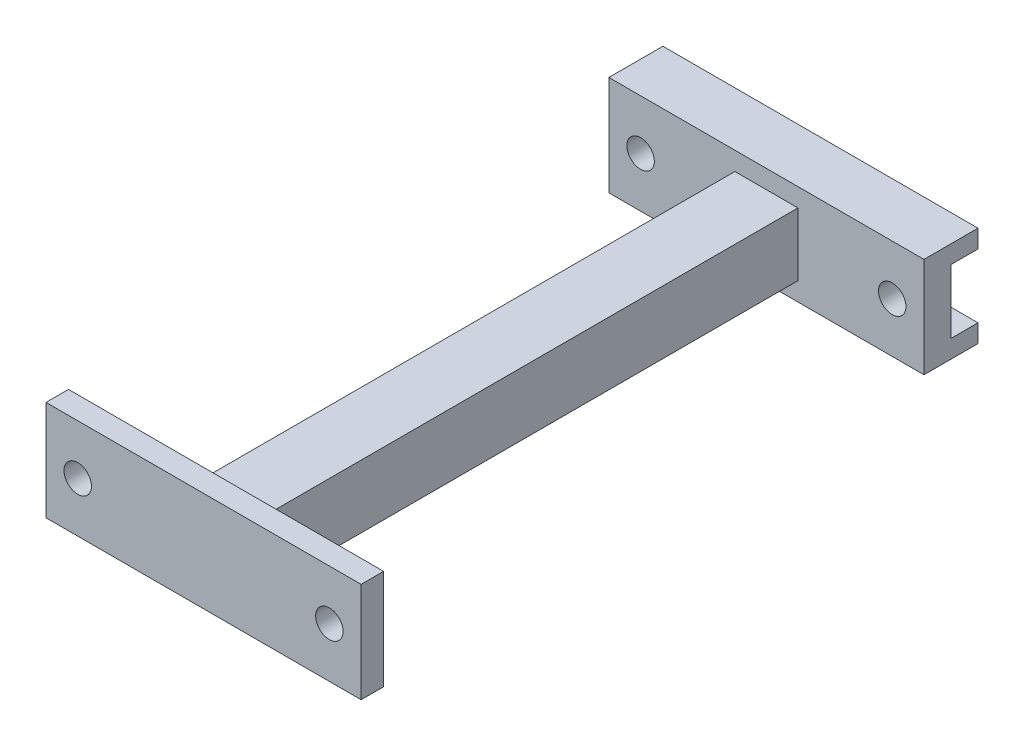
ISO-10303-21;
HEADER;
FILE_DESCRIPTION(('STEP AP214'),'2;1');
FILE_NAME('part.step','',(''),(''),'','','');
FILE_SCHEMA(('AUTOMOTIVE_DESIGN { 1 0 10303 214 1 1 1 1 }'));
ENDSEC;
DATA;
#1=APPLICATION_CONTEXT('core data for automotive mechanical design processes');
#2=APPLICATION_PROTOCOL_DEFINITION('international standard','automotive_design',2000,#1);
#3=PRODUCT_CONTEXT('',#1,'mechanical');
#4=PRODUCT('Part','Part','',(#3));
#5=PRODUCT_RELATED_PRODUCT_CATEGORY('part','',(#4));
#6=PRODUCT_DEFINITION_FORMATION('','',#4);
#7=PRODUCT_DEFINITION_CONTEXT('part definition',#1,'design');
#8=PRODUCT_DEFINITION('design','',#6,#7);
#9=PRODUCT_DEFINITION_SHAPE('','',#8);
#10=(LENGTH_UNIT() NAMED_UNIT(*) SI_UNIT(.MILLI.,.METRE.));
#11=(NAMED_UNIT(*) PLANE_ANGLE_UNIT() SI_UNIT($,.RADIAN.));
#12=(NAMED_UNIT(*) SI_UNIT($,.STERADIAN.) SOLID_ANGLE_UNIT());
#13=UNCERTAINTY_MEASURE_WITH_UNIT(LENGTH_MEASURE(1.E-05),#10,'distance_accuracy_value','');
#14=(GEOMETRIC_REPRESENTATION_CONTEXT(3) GLOBAL_UNCERTAINTY_ASSIGNED_CONTEXT((#13)) GLOBAL_UNIT_ASSIGNED_CONTEXT((#10,
#11,#12)) REPRESENTATION_CONTEXT('',''));
#15=CARTESIAN_POINT('',(0.,0.,0.));
#16=DIRECTION('',(0.,0.,1.));
#17=DIRECTION('',(1.,0.,0.));
#18=AXIS2_PLACEMENT_3D('',#15,#16,#17);
#19=CARTESIAN_POINT('',(0.,0.,3.));
#20=DIRECTION('',(0.,0.,1.));
#21=DIRECTION('',(1.,0.,0.));
#22=AXIS2_PLACEMENT_3D('',#19,#20,#21);
#23=PLANE('',#22);
#24=CARTESIAN_POINT('',(27.94,0.,3.));
#25=DIRECTION('',(0.,0.,1.));
#26=DIRECTION('',(1.,0.,0.));
#27=AXIS2_PLACEMENT_3D('',#24,#25,#26);
#28=CIRCLE('',#27,1.525);
#29=CARTESIAN_POINT('',(29.465,0.,3.));
#30=VERTEX_POINT('',#29);
#31=EDGE_CURVE('E269',#30,#30,#28,.T.);
#32=ORIENTED_EDGE('',*,*,#31,.F.);
#33=EDGE_LOOP('',(#32));
#34=FACE_BOUND('',#33,.T.);
#35=DIRECTION('',(0.,-1.,0.));
#36=VECTOR('',#35,1.);
#37=CARTESIAN_POINT('',(-3.525,3.55,3.));
#38=LINE('',#37,#36);
#39=CARTESIAN_POINT('',(-3.525,5.55,3.));
#40=VERTEX_POINT('',#39);
#41=CARTESIAN_POINT('',(-3.525,-5.55,3.));
#42=VERTEX_POINT('',#41);
#43=EDGE_CURVE('E43',#40,#42,#38,.T.);
#44=ORIENTED_EDGE('',*,*,#43,.T.);
#45=DIRECTION('',(1.,0.,0.));
#46=VECTOR('',#45,1.);
#47=CARTESIAN_POINT('',(31.465,-5.55,3.));
#48=LINE('',#47,#46);
#49=CARTESIAN_POINT('',(31.465,-5.55,3.));
#50=VERTEX_POINT('',#49);
#51=EDGE_CURVE('E234',#42,#50,#48,.T.);
#52=ORIENTED_EDGE('',*,*,#51,.T.);
#53=DIRECTION('',(0.,1.,0.));
#54=VECTOR('',#53,1.);
#55=CARTESIAN_POINT('',(31.465,3.55,3.));
#56=LINE('',#55,#54);
#57=CARTESIAN_POINT('',(31.465,5.55,3.));
#58=VERTEX_POINT('',#57);
#59=EDGE_CURVE('E11',#50,#58,#56,.T.);
#60=ORIENTED_EDGE('',*,*,#59,.T.);
#61=DIRECTION('',(-1.,0.,0.));
#62=VECTOR('',#61,1.);
#63=CARTESIAN_POINT('',(31.465,5.55,3.));
#64=LINE('',#63,#62);
#65=EDGE_CURVE('E209',#58,#40,#64,.T.);
#66=ORIENTED_EDGE('',*,*,#65,.T.);
#67=EDGE_LOOP('',(#44,#52,#60,#66));
#68=FACE_BOUND('',#67,.T.);
#69=CARTESIAN_POINT('',(0.,0.,3.));
#70=DIRECTION('',(0.,0.,1.));
#71=DIRECTION('',(1.,0.,0.));
#72=AXIS2_PLACEMENT_3D('',#69,#70,#71);
#73=CIRCLE('',#72,1.525);
#74=CARTESIAN_POINT('',(1.525,0.,3.));
#75=VERTEX_POINT('',#74);
#76=EDGE_CURVE('E275',#75,#75,#73,.T.);
#77=ORIENTED_EDGE('',*,*,#76,.F.);
#78=EDGE_LOOP('',(#77));
#79=FACE_BOUND('',#78,.T.);
#80=DIRECTION('',(1.,0.,0.));
#81=VECTOR('',#80,1.);
#82=CARTESIAN_POINT('',(10.47,-3.5,3.));
#83=LINE('',#82,#81);
#84=CARTESIAN_POINT('',(10.47,-3.5,3.));
#85=VERTEX_POINT('',#84);
#86=CARTESIAN_POINT('',(17.47,-3.5,3.));
#87=VERTEX_POINT('',#86);
#88=EDGE_CURVE('E177',#85,#87,#83,.T.);
#89=ORIENTED_EDGE('',*,*,#88,.F.);
#90=DIRECTION('',(0.,-1.,0.));
#91=VECTOR('',#90,1.);
#92=CARTESIAN_POINT('',(10.47,3.5,3.));
#93=LINE('',#92,#91);
#94=CARTESIAN_POINT('',(10.47,3.5,3.));
#95=VERTEX_POINT('',#94);
#96=EDGE_CURVE('E174',#95,#85,#93,.T.);
#97=ORIENTED_EDGE('',*,*,#96,.F.);
#98=DIRECTION('',(-1.,0.,0.));
#99=VECTOR('',#98,1.);
#100=CARTESIAN_POINT('',(10.47,3.5,3.));
#101=LINE('',#100,#99);
#102=CARTESIAN_POINT('',(17.47,3.5,3.));
#103=VERTEX_POINT('',#102);
#104=EDGE_CURVE('E187',#103,#95,#101,.T.);
#105=ORIENTED_EDGE('',*,*,#104,.F.);
#106=DIRECTION('',(0.,1.,0.));
#107=VECTOR('',#106,1.);
#108=CARTESIAN_POINT('',(17.47,3.5,3.));
#109=LINE('',#108,#107);
#110=EDGE_CURVE('E198',#87,#103,#109,.T.);
#111=ORIENTED_EDGE('',*,*,#110,.F.);
#112=EDGE_LOOP('',(#89,#97,#105,#111));
#113=FACE_BOUND('',#112,.T.);
#114=ADVANCED_FACE('F33',(#34,#68,#79,#113),#23,.T.);
#115=CARTESIAN_POINT('',(0.,0.,0.));
#116=DIRECTION('',(0.,0.,1.));
#117=DIRECTION('',(1.,0.,0.));
#118=AXIS2_PLACEMENT_3D('',#115,#116,#117);
#119=PLANE('',#118);
#120=CARTESIAN_POINT('',(0.,0.,0.));
#121=DIRECTION('',(0.,0.,1.));
#122=DIRECTION('',(1.,0.,0.));
#123=AXIS2_PLACEMENT_3D('',#120,#121,#122);
#124=CIRCLE('',#123,1.525);
#125=CARTESIAN_POINT('',(1.525,0.,0.));
#126=VERTEX_POINT('',#125);
#127=EDGE_CURVE('E272',#126,#126,#124,.T.);
#128=ORIENTED_EDGE('',*,*,#127,.T.);
#129=EDGE_LOOP('',(#128));
#130=FACE_BOUND('',#129,.T.);
#131=DIRECTION('',(0.,-1.,0.));
#132=VECTOR('',#131,1.);
#133=CARTESIAN_POINT('',(-3.525,3.55,0.));
#134=LINE('',#133,#132);
#135=CARTESIAN_POINT('',(-3.525,3.55,0.));
#136=VERTEX_POINT('',#135);
#137=CARTESIAN_POINT('',(-3.525,-3.55,0.));
#138=VERTEX_POINT('',#137);
#139=EDGE_CURVE('E278',#136,#138,#134,.T.);
#140=ORIENTED_EDGE('',*,*,#139,.F.);
#141=DIRECTION('',(-1.,0.,0.));
#142=VECTOR('',#141,1.);
#143=CARTESIAN_POINT('',(-3.525,3.55,0.));
#144=LINE('',#143,#142);
#145=CARTESIAN_POINT('',(31.465,3.55,0.));
#146=VERTEX_POINT('',#145);
#147=EDGE_CURVE('E37',#146,#136,#144,.T.);
#148=ORIENTED_EDGE('',*,*,#147,.F.);
#149=DIRECTION('',(0.,1.,0.));
#150=VECTOR('',#149,1.);
#151=CARTESIAN_POINT('',(31.465,3.55,0.));
#152=LINE('',#151,#150);
#153=CARTESIAN_POINT('',(31.465,-3.55,0.));
#154=VERTEX_POINT('',#153);
#155=EDGE_CURVE('E59',#154,#146,#152,.T.);
#156=ORIENTED_EDGE('',*,*,#155,.F.);
#157=DIRECTION('',(1.,0.,0.));
#158=VECTOR('',#157,1.);
#159=CARTESIAN_POINT('',(-3.525,-3.55,0.));
#160=LINE('',#159,#158);
#161=EDGE_CURVE('E286',#138,#154,#160,.T.);
#162=ORIENTED_EDGE('',*,*,#161,.F.);
#163=EDGE_LOOP('',(#140,#148,#156,#162));
#164=FACE_BOUND('',#163,.T.);
#165=CARTESIAN_POINT('',(27.94,0.,0.));
#166=DIRECTION('',(0.,0.,1.));
#167=DIRECTION('',(1.,0.,0.));
#168=AXIS2_PLACEMENT_3D('',#165,#166,#167);
#169=CIRCLE('',#168,1.525);
#170=CARTESIAN_POINT('',(29.465,0.,0.));
#171=VERTEX_POINT('',#170);
#172=EDGE_CURVE('E257',#171,#171,#169,.T.);
#173=ORIENTED_EDGE('',*,*,#172,.T.);
#174=EDGE_LOOP('',(#173));
#175=FACE_BOUND('',#174,.T.);
#176=ADVANCED_FACE('F323',(#130,#164,#175),#119,.F.);
#177=CARTESIAN_POINT('',(-3.525,3.55,3.));
#178=DIRECTION('',(1.,0.,0.));
#179=DIRECTION('',(0.,0.,-1.));
#180=AXIS2_PLACEMENT_3D('',#177,#178,#179);
#181=PLANE('',#180);
#182=ORIENTED_EDGE('',*,*,#139,.T.);
#183=DIRECTION('',(0.,0.,1.));
#184=VECTOR('',#183,1.);
#185=CARTESIAN_POINT('',(-3.525,-3.55,-3.));
#186=LINE('',#185,#184);
#187=CARTESIAN_POINT('',(-3.525,-3.55,-3.));
#188=VERTEX_POINT('',#187);
#189=EDGE_CURVE('E261',#188,#138,#186,.T.);
#190=ORIENTED_EDGE('',*,*,#189,.F.);
#191=DIRECTION('',(0.,-1.,0.));
#192=VECTOR('',#191,1.);
#193=CARTESIAN_POINT('',(-3.525,-3.55,-3.));
#194=LINE('',#193,#192);
#195=CARTESIAN_POINT('',(-3.525,-5.55,-3.));
#196=VERTEX_POINT('',#195);
#197=EDGE_CURVE('E245',#188,#196,#194,.T.);
#198=ORIENTED_EDGE('',*,*,#197,.T.);
#199=DIRECTION('',(0.,0.,1.));
#200=VECTOR('',#199,1.);
#201=CARTESIAN_POINT('',(-3.525,-5.55,-3.));
#202=LINE('',#201,#200);
#203=EDGE_CURVE('E258',#196,#42,#202,.T.);
#204=ORIENTED_EDGE('',*,*,#203,.T.);
#205=ORIENTED_EDGE('',*,*,#43,.F.);
#206=DIRECTION('',(0.,0.,1.));
#207=VECTOR('',#206,1.);
#208=CARTESIAN_POINT('',(-3.525,5.55,-3.));
#209=LINE('',#208,#207);
#210=CARTESIAN_POINT('',(-3.525,5.55,-3.));
#211=VERTEX_POINT('',#210);
#212=EDGE_CURVE('E227',#211,#40,#209,.T.);
#213=ORIENTED_EDGE('',*,*,#212,.F.);
#214=DIRECTION('',(0.,-1.,0.));
#215=VECTOR('',#214,1.);
#216=CARTESIAN_POINT('',(-3.525,3.55,-3.));
#217=LINE('',#216,#215);
#218=CARTESIAN_POINT('',(-3.525,3.55,-3.));
#219=VERTEX_POINT('',#218);
#220=EDGE_CURVE('E219',#211,#219,#217,.T.);
#221=ORIENTED_EDGE('',*,*,#220,.T.);
#222=DIRECTION('',(0.,0.,1.));
#223=VECTOR('',#222,1.);
#224=CARTESIAN_POINT('',(-3.525,3.55,-3.));
#225=LINE('',#224,#223);
#226=EDGE_CURVE('E230',#219,#136,#225,.T.);
#227=ORIENTED_EDGE('',*,*,#226,.T.);
#228=EDGE_LOOP('',(#182,#190,#198,#204,#205,#213,#221,#227));
#229=FACE_BOUND('',#228,.T.);
#230=ADVANCED_FACE('F35',(#229),#181,.F.);
#231=CARTESIAN_POINT('',(31.465,3.55,3.));
#232=DIRECTION('',(-1.,0.,0.));
#233=DIRECTION('',(0.,0.,1.));
#234=AXIS2_PLACEMENT_3D('',#231,#232,#233);
#235=PLANE('',#234);
#236=ORIENTED_EDGE('',*,*,#155,.T.);
#237=DIRECTION('',(0.,0.,1.));
#238=VECTOR('',#237,1.);
#239=CARTESIAN_POINT('',(31.465,3.55,-3.));
#240=LINE('',#239,#238);
#241=CARTESIAN_POINT('',(31.465,3.55,-3.));
#242=VERTEX_POINT('',#241);
#243=EDGE_CURVE('E222',#242,#146,#240,.T.);
#244=ORIENTED_EDGE('',*,*,#243,.F.);
#245=DIRECTION('',(0.,1.,0.));
#246=VECTOR('',#245,1.);
#247=CARTESIAN_POINT('',(31.465,3.55,-3.));
#248=LINE('',#247,#246);
#249=CARTESIAN_POINT('',(31.465,5.55,-3.));
#250=VERTEX_POINT('',#249);
#251=EDGE_CURVE('E213',#242,#250,#248,.T.);
#252=ORIENTED_EDGE('',*,*,#251,.T.);
#253=DIRECTION('',(0.,0.,1.));
#254=VECTOR('',#253,1.);
#255=CARTESIAN_POINT('',(31.465,5.55,-3.));
#256=LINE('',#255,#254);
#257=EDGE_CURVE('E238',#250,#58,#256,.T.);
#258=ORIENTED_EDGE('',*,*,#257,.T.);
#259=ORIENTED_EDGE('',*,*,#59,.F.);
#260=DIRECTION('',(0.,0.,1.));
#261=VECTOR('',#260,1.);
#262=CARTESIAN_POINT('',(31.465,-5.55,-3.));
#263=LINE('',#262,#261);
#264=CARTESIAN_POINT('',(31.465,-5.55,-3.));
#265=VERTEX_POINT('',#264);
#266=EDGE_CURVE('E254',#265,#50,#263,.T.);
#267=ORIENTED_EDGE('',*,*,#266,.F.);
#268=DIRECTION('',(0.,1.,0.));
#269=VECTOR('',#268,1.);
#270=CARTESIAN_POINT('',(31.465,-3.55,-3.));
#271=LINE('',#270,#269);
#272=CARTESIAN_POINT('',(31.465,-3.55,-3.));
#273=VERTEX_POINT('',#272);
#274=EDGE_CURVE('E239',#265,#273,#271,.T.);
#275=ORIENTED_EDGE('',*,*,#274,.T.);
#276=DIRECTION('',(0.,0.,1.));
#277=VECTOR('',#276,1.);
#278=CARTESIAN_POINT('',(31.465,-3.55,-3.));
#279=LINE('',#278,#277);
#280=EDGE_CURVE('E251',#273,#154,#279,.T.);
#281=ORIENTED_EDGE('',*,*,#280,.T.);
#282=EDGE_LOOP('',(#236,#244,#252,#258,#259,#267,#275,#281));
#283=FACE_BOUND('',#282,.T.);
#284=ADVANCED_FACE('F304',(#283),#235,.F.);
#285=CARTESIAN_POINT('',(0.,0.,3.));
#286=DIRECTION('',(0.,0.,-1.));
#287=DIRECTION('',(-1.,0.,0.));
#288=AXIS2_PLACEMENT_3D('',#285,#286,#287);
#289=CYLINDRICAL_SURFACE('',#288,1.525);
#290=ORIENTED_EDGE('',*,*,#76,.T.);
#291=EDGE_LOOP('',(#290));
#292=FACE_BOUND('',#291,.T.);
#293=ORIENTED_EDGE('',*,*,#127,.F.);
#294=EDGE_LOOP('',(#293));
#295=FACE_BOUND('',#294,.T.);
#296=ADVANCED_FACE('F332',(#292,#295),#289,.F.);
#297=CARTESIAN_POINT('',(27.94,0.,3.));
#298=DIRECTION('',(0.,0.,-1.));
#299=DIRECTION('',(-1.,0.,0.));
#300=AXIS2_PLACEMENT_3D('',#297,#298,#299);
#301=CYLINDRICAL_SURFACE('',#300,1.525);
#302=ORIENTED_EDGE('',*,*,#31,.T.);
#303=EDGE_LOOP('',(#302));
#304=FACE_BOUND('',#303,.T.);
#305=ORIENTED_EDGE('',*,*,#172,.F.);
#306=EDGE_LOOP('',(#305));
#307=FACE_BOUND('',#306,.T.);
#308=ADVANCED_FACE('F330',(#304,#307),#301,.F.);
#309=CARTESIAN_POINT('',(31.465,-5.55,-3.));
#310=DIRECTION('',(0.,-1.,0.));
#311=DIRECTION('',(1.,0.,0.));
#312=AXIS2_PLACEMENT_3D('',#309,#310,#311);
#313=PLANE('',#312);
#314=ORIENTED_EDGE('',*,*,#51,.F.);
#315=ORIENTED_EDGE('',*,*,#203,.F.);
#316=DIRECTION('',(1.,0.,0.));
#317=VECTOR('',#316,1.);
#318=CARTESIAN_POINT('',(31.465,-5.55,-3.));
#319=LINE('',#318,#317);
#320=EDGE_CURVE('E248',#196,#265,#319,.T.);
#321=ORIENTED_EDGE('',*,*,#320,.T.);
#322=ORIENTED_EDGE('',*,*,#266,.T.);
#323=EDGE_LOOP('',(#314,#315,#321,#322));
#324=FACE_BOUND('',#323,.T.);
#325=ADVANCED_FACE('F308',(#324),#313,.T.);
#326=CARTESIAN_POINT('',(31.465,-3.55,-3.));
#327=DIRECTION('',(0.,1.,0.));
#328=DIRECTION('',(-1.,0.,0.));
#329=AXIS2_PLACEMENT_3D('',#326,#327,#328);
#330=PLANE('',#329);
#331=ORIENTED_EDGE('',*,*,#189,.T.);
#332=ORIENTED_EDGE('',*,*,#161,.T.);
#333=ORIENTED_EDGE('',*,*,#280,.F.);
#334=DIRECTION('',(-1.,0.,0.));
#335=VECTOR('',#334,1.);
#336=CARTESIAN_POINT('',(31.465,-3.55,-3.));
#337=LINE('',#336,#335);
#338=EDGE_CURVE('E242',#273,#188,#337,.T.);
#339=ORIENTED_EDGE('',*,*,#338,.T.);
#340=EDGE_LOOP('',(#331,#332,#333,#339));
#341=FACE_BOUND('',#340,.T.);
#342=ADVANCED_FACE('F298',(#341),#330,.T.);
#343=CARTESIAN_POINT('',(0.,0.,-3.));
#344=DIRECTION('',(0.,0.,-1.));
#345=DIRECTION('',(-1.,0.,0.));
#346=AXIS2_PLACEMENT_3D('',#343,#344,#345);
#347=PLANE('',#346);
#348=ORIENTED_EDGE('',*,*,#274,.F.);
#349=ORIENTED_EDGE('',*,*,#320,.F.);
#350=ORIENTED_EDGE('',*,*,#197,.F.);
#351=ORIENTED_EDGE('',*,*,#338,.F.);
#352=EDGE_LOOP('',(#348,#349,#350,#351));
#353=FACE_BOUND('',#352,.T.);
#354=ADVANCED_FACE('F302',(#353),#347,.T.);
#355=CARTESIAN_POINT('',(31.465,3.55,-3.));
#356=DIRECTION('',(0.,-1.,0.));
#357=DIRECTION('',(1.,0.,0.));
#358=AXIS2_PLACEMENT_3D('',#355,#356,#357);
#359=PLANE('',#358);
#360=ORIENTED_EDGE('',*,*,#243,.T.);
#361=ORIENTED_EDGE('',*,*,#147,.T.);
#362=ORIENTED_EDGE('',*,*,#226,.F.);
#363=DIRECTION('',(1.,0.,0.));
#364=VECTOR('',#363,1.);
#365=CARTESIAN_POINT('',(31.465,3.55,-3.));
#366=LINE('',#365,#364);
#367=EDGE_CURVE('E210',#219,#242,#366,.T.);
#368=ORIENTED_EDGE('',*,*,#367,.T.);
#369=EDGE_LOOP('',(#360,#361,#362,#368));
#370=FACE_BOUND('',#369,.T.);
#371=ADVANCED_FACE('F322',(#370),#359,.T.);
#372=CARTESIAN_POINT('',(31.465,5.55,-3.));
#373=DIRECTION('',(0.,1.,0.));
#374=DIRECTION('',(-1.,0.,0.));
#375=AXIS2_PLACEMENT_3D('',#372,#373,#374);
#376=PLANE('',#375);
#377=ORIENTED_EDGE('',*,*,#65,.F.);
#378=ORIENTED_EDGE('',*,*,#257,.F.);
#379=DIRECTION('',(-1.,0.,0.));
#380=VECTOR('',#379,1.);
#381=CARTESIAN_POINT('',(31.465,5.55,-3.));
#382=LINE('',#381,#380);
#383=EDGE_CURVE('E216',#250,#211,#382,.T.);
#384=ORIENTED_EDGE('',*,*,#383,.T.);
#385=ORIENTED_EDGE('',*,*,#212,.T.);
#386=EDGE_LOOP('',(#377,#378,#384,#385));
#387=FACE_BOUND('',#386,.T.);
#388=ADVANCED_FACE('F314',(#387),#376,.T.);
#389=CARTESIAN_POINT('',(0.,0.,-3.));
#390=DIRECTION('',(0.,0.,-1.));
#391=DIRECTION('',(-1.,0.,0.));
#392=AXIS2_PLACEMENT_3D('',#389,#390,#391);
#393=PLANE('',#392);
#394=ORIENTED_EDGE('',*,*,#367,.F.);
#395=ORIENTED_EDGE('',*,*,#220,.F.);
#396=ORIENTED_EDGE('',*,*,#383,.F.);
#397=ORIENTED_EDGE('',*,*,#251,.F.);
#398=EDGE_LOOP('',(#394,#395,#396,#397));
#399=FACE_BOUND('',#398,.T.);
#400=ADVANCED_FACE('F320',(#399),#393,.T.);
#401=CARTESIAN_POINT('',(10.47,3.5,63.));
#402=DIRECTION('',(1.,0.,0.));
#403=DIRECTION('',(0.,1.,0.));
#404=AXIS2_PLACEMENT_3D('',#401,#402,#403);
#405=PLANE('',#404);
#406=ORIENTED_EDGE('',*,*,#96,.T.);
#407=DIRECTION('',(0.,0.,-1.));
#408=VECTOR('',#407,1.);
#409=CARTESIAN_POINT('',(10.47,-3.5,63.));
#410=LINE('',#409,#408);
#411=CARTESIAN_POINT('',(10.47,-3.5,63.));
#412=VERTEX_POINT('',#411);
#413=EDGE_CURVE('E207',#412,#85,#410,.T.);
#414=ORIENTED_EDGE('',*,*,#413,.F.);
#415=DIRECTION('',(0.,-1.,0.));
#416=VECTOR('',#415,1.);
#417=CARTESIAN_POINT('',(10.47,3.5,63.));
#418=LINE('',#417,#416);
#419=CARTESIAN_POINT('',(10.47,3.5,63.));
#420=VERTEX_POINT('',#419);
#421=EDGE_CURVE('E183',#420,#412,#418,.T.);
#422=ORIENTED_EDGE('',*,*,#421,.F.);
#423=DIRECTION('',(0.,0.,-1.));
#424=VECTOR('',#423,1.);
#425=CARTESIAN_POINT('',(10.47,3.5,63.));
#426=LINE('',#425,#424);
#427=EDGE_CURVE('E195',#420,#95,#426,.T.);
#428=ORIENTED_EDGE('',*,*,#427,.T.);
#429=EDGE_LOOP('',(#406,#414,#422,#428));
#430=FACE_BOUND('',#429,.T.);
#431=ADVANCED_FACE('F429',(#430),#405,.F.);
#432=CARTESIAN_POINT('',(10.47,-3.5,63.));
#433=DIRECTION('',(0.,1.,0.));
#434=DIRECTION('',(0.,0.,1.));
#435=AXIS2_PLACEMENT_3D('',#432,#433,#434);
#436=PLANE('',#435);
#437=ORIENTED_EDGE('',*,*,#88,.T.);
#438=DIRECTION('',(0.,0.,-1.));
#439=VECTOR('',#438,1.);
#440=CARTESIAN_POINT('',(17.47,-3.5,63.));
#441=LINE('',#440,#439);
#442=CARTESIAN_POINT('',(17.47,-3.5,63.));
#443=VERTEX_POINT('',#442);
#444=EDGE_CURVE('E204',#443,#87,#441,.T.);
#445=ORIENTED_EDGE('',*,*,#444,.F.);
#446=DIRECTION('',(1.,0.,0.));
#447=VECTOR('',#446,1.);
#448=CARTESIAN_POINT('',(10.47,-3.5,63.));
#449=LINE('',#448,#447);
#450=EDGE_CURVE('E186',#412,#443,#449,.T.);
#451=ORIENTED_EDGE('',*,*,#450,.F.);
#452=ORIENTED_EDGE('',*,*,#413,.T.);
#453=EDGE_LOOP('',(#437,#445,#451,#452));
#454=FACE_BOUND('',#453,.T.);
#455=ADVANCED_FACE('F447',(#454),#436,.F.);
#456=CARTESIAN_POINT('',(17.47,3.5,63.));
#457=DIRECTION('',(-1.,0.,0.));
#458=DIRECTION('',(0.,0.,1.));
#459=AXIS2_PLACEMENT_3D('',#456,#457,#458);
#460=PLANE('',#459);
#461=ORIENTED_EDGE('',*,*,#110,.T.);
#462=DIRECTION('',(0.,0.,-1.));
#463=VECTOR('',#462,1.);
#464=CARTESIAN_POINT('',(17.47,3.5,63.));
#465=LINE('',#464,#463);
#466=CARTESIAN_POINT('',(17.47,3.5,63.));
#467=VERTEX_POINT('',#466);
#468=EDGE_CURVE('E51',#467,#103,#465,.T.);
#469=ORIENTED_EDGE('',*,*,#468,.F.);
#470=DIRECTION('',(0.,1.,0.));
#471=VECTOR('',#470,1.);
#472=CARTESIAN_POINT('',(17.47,3.5,63.));
#473=LINE('',#472,#471);
#474=EDGE_CURVE('E190',#443,#467,#473,.T.);
#475=ORIENTED_EDGE('',*,*,#474,.F.);
#476=ORIENTED_EDGE('',*,*,#444,.T.);
#477=EDGE_LOOP('',(#461,#469,#475,#476));
#478=FACE_BOUND('',#477,.T.);
#479=ADVANCED_FACE('F456',(#478),#460,.F.);
#480=CARTESIAN_POINT('',(10.47,3.5,63.));
#481=DIRECTION('',(0.,-1.,0.));
#482=DIRECTION('',(0.,0.,-1.));
#483=AXIS2_PLACEMENT_3D('',#480,#481,#482);
#484=PLANE('',#483);
#485=ORIENTED_EDGE('',*,*,#104,.T.);
#486=ORIENTED_EDGE('',*,*,#427,.F.);
#487=DIRECTION('',(-1.,0.,0.));
#488=VECTOR('',#487,1.);
#489=CARTESIAN_POINT('',(10.47,3.5,63.));
#490=LINE('',#489,#488);
#491=EDGE_CURVE('E193',#467,#420,#490,.T.);
#492=ORIENTED_EDGE('',*,*,#491,.F.);
#493=ORIENTED_EDGE('',*,*,#468,.T.);
#494=EDGE_LOOP('',(#485,#486,#492,#493));
#495=FACE_BOUND('',#494,.T.);
#496=ADVANCED_FACE('F465',(#495),#484,.F.);
#497=CARTESIAN_POINT('',(0.,0.,63.));
#498=DIRECTION('',(0.,0.,1.));
#499=DIRECTION('',(1.,0.,0.));
#500=AXIS2_PLACEMENT_3D('',#497,#498,#499);
#501=PLANE('',#500);
#502=CARTESIAN_POINT('',(27.94,0.,63.));
#503=DIRECTION('',(0.,0.,1.));
#504=DIRECTION('',(1.,0.,0.));
#505=AXIS2_PLACEMENT_3D('',#502,#503,#504);
#506=CIRCLE('',#505,1.525);
#507=CARTESIAN_POINT('',(29.465,0.,63.));
#508=VERTEX_POINT('',#507);
#509=EDGE_CURVE('E566',#508,#508,#506,.T.);
#510=ORIENTED_EDGE('',*,*,#509,.T.);
#511=EDGE_LOOP('',(#510));
#512=FACE_BOUND('',#511,.T.);
#513=DIRECTION('',(-1.,0.,0.));
#514=VECTOR('',#513,1.);
#515=CARTESIAN_POINT('',(31.465,5.55,63.));
#516=LINE('',#515,#514);
#517=CARTESIAN_POINT('',(31.465,5.55,63.));
#518=VERTEX_POINT('',#517);
#519=CARTESIAN_POINT('',(-3.525,5.55,63.));
#520=VERTEX_POINT('',#519);
#521=EDGE_CURVE('E173',#518,#520,#516,.T.);
#522=ORIENTED_EDGE('',*,*,#521,.F.);
#523=DIRECTION('',(0.,1.,0.));
#524=VECTOR('',#523,1.);
#525=CARTESIAN_POINT('',(31.465,-5.55,63.));
#526=LINE('',#525,#524);
#527=CARTESIAN_POINT('',(31.465,-5.55,63.));
#528=VERTEX_POINT('',#527);
#529=EDGE_CURVE('E169',#528,#518,#526,.T.);
#530=ORIENTED_EDGE('',*,*,#529,.F.);
#531=DIRECTION('',(1.,0.,0.));
#532=VECTOR('',#531,1.);
#533=CARTESIAN_POINT('',(-3.525,-5.55,63.));
#534=LINE('',#533,#532);
#535=CARTESIAN_POINT('',(-3.525,-5.55,63.));
#536=VERTEX_POINT('',#535);
#537=EDGE_CURVE('E582',#536,#528,#534,.T.);
#538=ORIENTED_EDGE('',*,*,#537,.F.);
#539=DIRECTION('',(0.,-1.,0.));
#540=VECTOR('',#539,1.);
#541=CARTESIAN_POINT('',(-3.525,5.55,63.));
#542=LINE('',#541,#540);
#543=EDGE_CURVE('E580',#520,#536,#542,.T.);
#544=ORIENTED_EDGE('',*,*,#543,.F.);
#545=EDGE_LOOP('',(#522,#530,#538,#544));
#546=FACE_BOUND('',#545,.T.);
#547=CARTESIAN_POINT('',(0.,0.,63.));
#548=DIRECTION('',(0.,0.,1.));
#549=DIRECTION('',(1.,0.,0.));
#550=AXIS2_PLACEMENT_3D('',#547,#548,#549);
#551=CIRCLE('',#550,1.525);
#552=CARTESIAN_POINT('',(1.525,0.,63.));
#553=VERTEX_POINT('',#552);
#554=EDGE_CURVE('E568',#553,#553,#551,.T.);
#555=ORIENTED_EDGE('',*,*,#554,.T.);
#556=EDGE_LOOP('',(#555));
#557=FACE_BOUND('',#556,.T.);
#558=ORIENTED_EDGE('',*,*,#491,.T.);
#559=ORIENTED_EDGE('',*,*,#421,.T.);
#560=ORIENTED_EDGE('',*,*,#450,.T.);
#561=ORIENTED_EDGE('',*,*,#474,.T.);
#562=EDGE_LOOP('',(#558,#559,#560,#561));
#563=FACE_BOUND('',#562,.T.);
#564=ADVANCED_FACE('F474',(#512,#546,#557,#563),#501,.F.);
#565=CARTESIAN_POINT('',(0.,0.,65.5));
#566=DIRECTION('',(0.,0.,1.));
#567=DIRECTION('',(1.,0.,0.));
#568=AXIS2_PLACEMENT_3D('',#565,#566,#567);
#569=PLANE('',#568);
#570=CARTESIAN_POINT('',(0.,0.,65.5));
#571=DIRECTION('',(0.,0.,1.));
#572=DIRECTION('',(1.,0.,0.));
#573=AXIS2_PLACEMENT_3D('',#570,#571,#572);
#574=CIRCLE('',#573,1.525);
#575=CARTESIAN_POINT('',(1.525,0.,65.5));
#576=VERTEX_POINT('',#575);
#577=EDGE_CURVE('E571',#576,#576,#574,.T.);
#578=ORIENTED_EDGE('',*,*,#577,.F.);
#579=EDGE_LOOP('',(#578));
#580=FACE_BOUND('',#579,.T.);
#581=DIRECTION('',(-1.,0.,0.));
#582=VECTOR('',#581,1.);
#583=CARTESIAN_POINT('',(31.465,5.55,65.5));
#584=LINE('',#583,#582);
#585=CARTESIAN_POINT('',(31.465,5.55,65.5));
#586=VERTEX_POINT('',#585);
#587=CARTESIAN_POINT('',(-3.525,5.55,65.5));
#588=VERTEX_POINT('',#587);
#589=EDGE_CURVE('E159',#586,#588,#584,.T.);
#590=ORIENTED_EDGE('',*,*,#589,.T.);
#591=DIRECTION('',(0.,-1.,0.));
#592=VECTOR('',#591,1.);
#593=CARTESIAN_POINT('',(-3.525,5.55,65.5));
#594=LINE('',#593,#592);
#595=CARTESIAN_POINT('',(-3.525,-5.55,65.5));
#596=VERTEX_POINT('',#595);
#597=EDGE_CURVE('E148',#588,#596,#594,.T.);
#598=ORIENTED_EDGE('',*,*,#597,.T.);
#599=DIRECTION('',(1.,0.,0.));
#600=VECTOR('',#599,1.);
#601=CARTESIAN_POINT('',(-3.525,-5.55,65.5));
#602=LINE('',#601,#600);
#603=CARTESIAN_POINT('',(31.465,-5.55,65.5));
#604=VERTEX_POINT('',#603);
#605=EDGE_CURVE('E158',#596,#604,#602,.T.);
#606=ORIENTED_EDGE('',*,*,#605,.T.);
#607=DIRECTION('',(0.,1.,0.));
#608=VECTOR('',#607,1.);
#609=CARTESIAN_POINT('',(31.465,-5.55,65.5));
#610=LINE('',#609,#608);
#611=EDGE_CURVE('E165',#604,#586,#610,.T.);
#612=ORIENTED_EDGE('',*,*,#611,.T.);
#613=EDGE_LOOP('',(#590,#598,#606,#612));
#614=FACE_BOUND('',#613,.T.);
#615=CARTESIAN_POINT('',(27.94,0.,65.5));
#616=DIRECTION('',(0.,0.,1.));
#617=DIRECTION('',(1.,0.,0.));
#618=AXIS2_PLACEMENT_3D('',#615,#616,#617);
#619=CIRCLE('',#618,1.525);
#620=CARTESIAN_POINT('',(29.465,0.,65.5));
#621=VERTEX_POINT('',#620);
#622=EDGE_CURVE('E563',#621,#621,#619,.T.);
#623=ORIENTED_EDGE('',*,*,#622,.F.);
#624=EDGE_LOOP('',(#623));
#625=FACE_BOUND('',#624,.T.);
#626=ADVANCED_FACE('F162',(#580,#614,#625),#569,.T.);
#627=CARTESIAN_POINT('',(31.465,5.55,65.5));
#628=DIRECTION('',(0.,-1.,0.));
#629=DIRECTION('',(1.,0.,0.));
#630=AXIS2_PLACEMENT_3D('',#627,#628,#629);
#631=PLANE('',#630);
#632=ORIENTED_EDGE('',*,*,#521,.T.);
#633=DIRECTION('',(0.,0.,-1.));
#634=VECTOR('',#633,1.);
#635=CARTESIAN_POINT('',(-3.525,5.55,65.5));
#636=LINE('',#635,#634);
#637=EDGE_CURVE('E152',#588,#520,#636,.T.);
#638=ORIENTED_EDGE('',*,*,#637,.F.);
#639=ORIENTED_EDGE('',*,*,#589,.F.);
#640=DIRECTION('',(0.,0.,-1.));
#641=VECTOR('',#640,1.);
#642=CARTESIAN_POINT('',(31.465,5.55,65.5));
#643=LINE('',#642,#641);
#644=EDGE_CURVE('E578',#586,#518,#643,.T.);
#645=ORIENTED_EDGE('',*,*,#644,.T.);
#646=EDGE_LOOP('',(#632,#638,#639,#645));
#647=FACE_BOUND('',#646,.T.);
#648=ADVANCED_FACE('F171',(#647),#631,.F.);
#649=CARTESIAN_POINT('',(-3.525,5.55,65.5));
#650=DIRECTION('',(1.,0.,0.));
#651=DIRECTION('',(0.,0.,-1.));
#652=AXIS2_PLACEMENT_3D('',#649,#650,#651);
#653=PLANE('',#652);
#654=ORIENTED_EDGE('',*,*,#543,.T.);
#655=DIRECTION('',(0.,0.,-1.));
#656=VECTOR('',#655,1.);
#657=CARTESIAN_POINT('',(-3.525,-5.55,65.5));
#658=LINE('',#657,#656);
#659=EDGE_CURVE('E155',#596,#536,#658,.T.);
#660=ORIENTED_EDGE('',*,*,#659,.F.);
#661=ORIENTED_EDGE('',*,*,#597,.F.);
#662=ORIENTED_EDGE('',*,*,#637,.T.);
#663=EDGE_LOOP('',(#654,#660,#661,#662));
#664=FACE_BOUND('',#663,.T.);
#665=ADVANCED_FACE('F150',(#664),#653,.F.);
#666=CARTESIAN_POINT('',(-3.525,-5.55,65.5));
#667=DIRECTION('',(0.,1.,0.));
#668=DIRECTION('',(-1.,0.,0.));
#669=AXIS2_PLACEMENT_3D('',#666,#667,#668);
#670=PLANE('',#669);
#671=ORIENTED_EDGE('',*,*,#537,.T.);
#672=DIRECTION('',(0.,0.,-1.));
#673=VECTOR('',#672,1.);
#674=CARTESIAN_POINT('',(31.465,-5.55,65.5));
#675=LINE('',#674,#673);
#676=EDGE_CURVE('E179',#604,#528,#675,.T.);
#677=ORIENTED_EDGE('',*,*,#676,.F.);
#678=ORIENTED_EDGE('',*,*,#605,.F.);
#679=ORIENTED_EDGE('',*,*,#659,.T.);
#680=EDGE_LOOP('',(#671,#677,#678,#679));
#681=FACE_BOUND('',#680,.T.);
#682=ADVANCED_FACE('F505',(#681),#670,.F.);
#683=CARTESIAN_POINT('',(31.465,-5.55,65.5));
#684=DIRECTION('',(-1.,0.,0.));
#685=DIRECTION('',(0.,0.,1.));
#686=AXIS2_PLACEMENT_3D('',#683,#684,#685);
#687=PLANE('',#686);
#688=ORIENTED_EDGE('',*,*,#529,.T.);
#689=ORIENTED_EDGE('',*,*,#644,.F.);
#690=ORIENTED_EDGE('',*,*,#611,.F.);
#691=ORIENTED_EDGE('',*,*,#676,.T.);
#692=EDGE_LOOP('',(#688,#689,#690,#691));
#693=FACE_BOUND('',#692,.T.);
#694=ADVANCED_FACE('F513',(#693),#687,.F.);
#695=CARTESIAN_POINT('',(0.,0.,65.5));
#696=DIRECTION('',(0.,0.,-1.));
#697=DIRECTION('',(-1.,0.,0.));
#698=AXIS2_PLACEMENT_3D('',#695,#696,#697);
#699=CYLINDRICAL_SURFACE('',#698,1.525);
#700=ORIENTED_EDGE('',*,*,#577,.T.);
#701=EDGE_LOOP('',(#700));
#702=FACE_BOUND('',#701,.T.);
#703=ORIENTED_EDGE('',*,*,#554,.F.);
#704=EDGE_LOOP('',(#703));
#705=FACE_BOUND('',#704,.T.);
#706=ADVANCED_FACE('F522',(#702,#705),#699,.F.);
#707=CARTESIAN_POINT('',(27.94,0.,65.5));
#708=DIRECTION('',(0.,0.,-1.));
#709=DIRECTION('',(-1.,0.,0.));
#710=AXIS2_PLACEMENT_3D('',#707,#708,#709);
#711=CYLINDRICAL_SURFACE('',#710,1.525);
#712=ORIENTED_EDGE('',*,*,#622,.T.);
#713=EDGE_LOOP('',(#712));
#714=FACE_BOUND('',#713,.T.);
#715=ORIENTED_EDGE('',*,*,#509,.F.);
#716=EDGE_LOOP('',(#715));
#717=FACE_BOUND('',#716,.T.);
#718=ADVANCED_FACE('F531',(#714,#717),#711,.F.);
#719=CLOSED_SHELL('',(#114,#176,#230,#284,#296,#308,#325,#342,#354,#371,#388,#400,#431,#455,
#479,#496,#564,#626,#648,#665,#682,#694,#706,#718));
#720=MANIFOLD_SOLID_BREP('B2',#719);
#721=ADVANCED_BREP_SHAPE_REPRESENTATION('',(#18,#720),#14);
#722=SHAPE_DEFINITION_REPRESENTATION(#9,#721);
ENDSEC;
END-ISO-10303-21;
